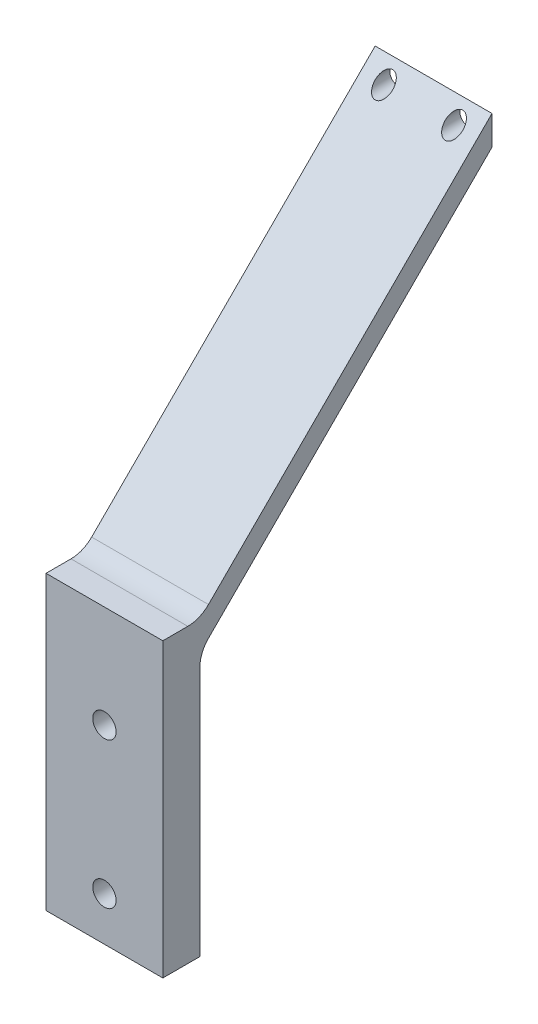
ISO-10303-21;
HEADER;
FILE_DESCRIPTION(('STEP AP214'),'2;1');
FILE_NAME('part.step','',(''),(''),'','','');
FILE_SCHEMA(('AUTOMOTIVE_DESIGN { 1 0 10303 214 1 1 1 1 }'));
ENDSEC;
DATA;
#1=APPLICATION_CONTEXT('core data for automotive mechanical design processes');
#2=APPLICATION_PROTOCOL_DEFINITION('international standard','automotive_design',2000,#1);
#3=PRODUCT_CONTEXT('',#1,'mechanical');
#4=PRODUCT('Part','Part','',(#3));
#5=PRODUCT_RELATED_PRODUCT_CATEGORY('part','',(#4));
#6=PRODUCT_DEFINITION_FORMATION('','',#4);
#7=PRODUCT_DEFINITION_CONTEXT('part definition',#1,'design');
#8=PRODUCT_DEFINITION('design','',#6,#7);
#9=PRODUCT_DEFINITION_SHAPE('','',#8);
#10=(LENGTH_UNIT() NAMED_UNIT(*) SI_UNIT(.MILLI.,.METRE.));
#11=(NAMED_UNIT(*) PLANE_ANGLE_UNIT() SI_UNIT($,.RADIAN.));
#12=(NAMED_UNIT(*) SI_UNIT($,.STERADIAN.) SOLID_ANGLE_UNIT());
#13=UNCERTAINTY_MEASURE_WITH_UNIT(LENGTH_MEASURE(1.E-05),#10,'distance_accuracy_value','');
#14=(GEOMETRIC_REPRESENTATION_CONTEXT(3) GLOBAL_UNCERTAINTY_ASSIGNED_CONTEXT((#13)) GLOBAL_UNIT_ASSIGNED_CONTEXT((#10,
#11,#12)) REPRESENTATION_CONTEXT('',''));
#15=CARTESIAN_POINT('',(0.,0.,0.));
#16=DIRECTION('',(0.,0.,1.));
#17=DIRECTION('',(1.,0.,0.));
#18=AXIS2_PLACEMENT_3D('',#15,#16,#17);
#19=CARTESIAN_POINT('',(0.,0.,0.));
#20=DIRECTION('',(0.,0.,-1.));
#21=DIRECTION('',(-1.,0.,0.));
#22=AXIS2_PLACEMENT_3D('',#19,#20,#21);
#23=PLANE('',#22);
#24=CARTESIAN_POINT('',(10.,32.5,0.));
#25=DIRECTION('',(0.,0.,1.));
#26=DIRECTION('',(1.,0.,0.));
#27=AXIS2_PLACEMENT_3D('',#24,#25,#26);
#28=CIRCLE('',#27,2.);
#29=CARTESIAN_POINT('',(12.,32.5,0.));
#30=VERTEX_POINT('',#29);
#31=EDGE_CURVE('E141',#30,#30,#28,.T.);
#32=ORIENTED_EDGE('',*,*,#31,.T.);
#33=EDGE_LOOP('',(#32));
#34=FACE_BOUND('',#33,.T.);
#35=CARTESIAN_POINT('',(10.,7.5,0.));
#36=DIRECTION('',(0.,0.,1.));
#37=DIRECTION('',(1.,0.,0.));
#38=AXIS2_PLACEMENT_3D('',#35,#36,#37);
#39=CIRCLE('',#38,2.);
#40=CARTESIAN_POINT('',(12.,7.5,0.));
#41=VERTEX_POINT('',#40);
#42=EDGE_CURVE('E137',#41,#41,#39,.T.);
#43=ORIENTED_EDGE('',*,*,#42,.T.);
#44=EDGE_LOOP('',(#43));
#45=FACE_BOUND('',#44,.T.);
#46=DIRECTION('',(0.,-1.,0.));
#47=VECTOR('',#46,1.);
#48=CARTESIAN_POINT('',(0.,0.,0.));
#49=LINE('',#48,#47);
#50=CARTESIAN_POINT('',(0.,42.9289321881345,0.));
#51=VERTEX_POINT('',#50);
#52=CARTESIAN_POINT('',(0.,0.,0.));
#53=VERTEX_POINT('',#52);
#54=EDGE_CURVE('E147',#51,#53,#49,.T.);
#55=ORIENTED_EDGE('',*,*,#54,.F.);
#56=DIRECTION('',(1.,0.,0.));
#57=VECTOR('',#56,1.);
#58=CARTESIAN_POINT('',(20.,42.9289321881345,0.));
#59=LINE('',#58,#57);
#60=CARTESIAN_POINT('',(20.,42.9289321881345,0.));
#61=VERTEX_POINT('',#60);
#62=EDGE_CURVE('E173',#51,#61,#59,.T.);
#63=ORIENTED_EDGE('',*,*,#62,.T.);
#64=DIRECTION('',(0.,1.,0.));
#65=VECTOR('',#64,1.);
#66=CARTESIAN_POINT('',(20.,0.,0.));
#67=LINE('',#66,#65);
#68=CARTESIAN_POINT('',(20.,0.,0.));
#69=VERTEX_POINT('',#68);
#70=EDGE_CURVE('E154',#69,#61,#67,.T.);
#71=ORIENTED_EDGE('',*,*,#70,.F.);
#72=DIRECTION('',(1.,0.,0.));
#73=VECTOR('',#72,1.);
#74=CARTESIAN_POINT('',(0.,0.,0.));
#75=LINE('',#74,#73);
#76=EDGE_CURVE('E160',#53,#69,#75,.T.);
#77=ORIENTED_EDGE('',*,*,#76,.F.);
#78=EDGE_LOOP('',(#55,#63,#71,#77));
#79=FACE_BOUND('',#78,.T.);
#80=ADVANCED_FACE('F33',(#34,#45,#79),#23,.T.);
#81=CARTESIAN_POINT('',(0.,0.,6.35));
#82=DIRECTION('',(0.,0.,-1.));
#83=DIRECTION('',(-1.,0.,0.));
#84=AXIS2_PLACEMENT_3D('',#81,#82,#83);
#85=PLANE('',#84);
#86=DIRECTION('',(0.,-1.,0.));
#87=VECTOR('',#86,1.);
#88=CARTESIAN_POINT('',(0.,0.,6.35));
#89=LINE('',#88,#87);
#90=CARTESIAN_POINT('',(0.,50.,6.35));
#91=VERTEX_POINT('',#90);
#92=CARTESIAN_POINT('',(0.,0.,6.35));
#93=VERTEX_POINT('',#92);
#94=EDGE_CURVE('E150',#91,#93,#89,.T.);
#95=ORIENTED_EDGE('',*,*,#94,.T.);
#96=DIRECTION('',(1.,0.,0.));
#97=VECTOR('',#96,1.);
#98=CARTESIAN_POINT('',(0.,0.,6.35));
#99=LINE('',#98,#97);
#100=CARTESIAN_POINT('',(20.,0.,6.35));
#101=VERTEX_POINT('',#100);
#102=EDGE_CURVE('E153',#93,#101,#99,.T.);
#103=ORIENTED_EDGE('',*,*,#102,.T.);
#104=DIRECTION('',(0.,1.,0.));
#105=VECTOR('',#104,1.);
#106=CARTESIAN_POINT('',(20.,0.,6.35));
#107=LINE('',#106,#105);
#108=CARTESIAN_POINT('',(20.,50.,6.35));
#109=VERTEX_POINT('',#108);
#110=EDGE_CURVE('E156',#101,#109,#107,.T.);
#111=ORIENTED_EDGE('',*,*,#110,.T.);
#112=DIRECTION('',(1.,0.,0.));
#113=VECTOR('',#112,1.);
#114=CARTESIAN_POINT('',(0.,50.,6.35));
#115=LINE('',#114,#113);
#116=EDGE_CURVE('E131',#91,#109,#115,.T.);
#117=ORIENTED_EDGE('',*,*,#116,.F.);
#118=EDGE_LOOP('',(#95,#103,#111,#117));
#119=FACE_BOUND('',#118,.T.);
#120=CARTESIAN_POINT('',(10.,32.5,6.35));
#121=DIRECTION('',(0.,0.,1.));
#122=DIRECTION('',(1.,0.,0.));
#123=AXIS2_PLACEMENT_3D('',#120,#121,#122);
#124=CIRCLE('',#123,2.);
#125=CARTESIAN_POINT('',(12.,32.5,6.35));
#126=VERTEX_POINT('',#125);
#127=EDGE_CURVE('E144',#126,#126,#124,.T.);
#128=ORIENTED_EDGE('',*,*,#127,.F.);
#129=EDGE_LOOP('',(#128));
#130=FACE_BOUND('',#129,.T.);
#131=CARTESIAN_POINT('',(10.,7.5,6.35));
#132=DIRECTION('',(0.,0.,1.));
#133=DIRECTION('',(1.,0.,0.));
#134=AXIS2_PLACEMENT_3D('',#131,#132,#133);
#135=CIRCLE('',#134,2.);
#136=CARTESIAN_POINT('',(12.,7.5,6.35));
#137=VERTEX_POINT('',#136);
#138=EDGE_CURVE('E138',#137,#137,#135,.T.);
#139=ORIENTED_EDGE('',*,*,#138,.F.);
#140=EDGE_LOOP('',(#139));
#141=FACE_BOUND('',#140,.T.);
#142=ADVANCED_FACE('F230',(#119,#130,#141),#85,.F.);
#143=CARTESIAN_POINT('',(0.,0.,6.35));
#144=DIRECTION('',(1.,0.,0.));
#145=DIRECTION('',(0.,0.,-1.));
#146=AXIS2_PLACEMENT_3D('',#143,#144,#145);
#147=PLANE('',#146);
#148=DIRECTION('',(0.,0.,1.));
#149=VECTOR('',#148,1.);
#150=CARTESIAN_POINT('',(0.,50.,0.));
#151=LINE('',#150,#149);
#152=CARTESIAN_POINT('',(0.,50.,2.07106781186548));
#153=VERTEX_POINT('',#152);
#154=EDGE_CURVE('E129',#153,#91,#151,.T.);
#155=ORIENTED_EDGE('',*,*,#154,.F.);
#156=CARTESIAN_POINT('',(0.,55.,2.07106781186548));
#157=DIRECTION('',(1.,0.,0.));
#158=DIRECTION('',(0.,0.,-1.));
#159=AXIS2_PLACEMENT_3D('',#156,#157,#158);
#160=CIRCLE('',#159,5.);
#161=CARTESIAN_POINT('',(0.,51.4644660940673,-1.46446609406726));
#162=VERTEX_POINT('',#161);
#163=EDGE_CURVE('E177',#153,#162,#160,.T.);
#164=ORIENTED_EDGE('',*,*,#163,.T.);
#165=DIRECTION('',(0.,0.707106781186548,-0.707106781186547));
#166=VECTOR('',#165,1.);
#167=CARTESIAN_POINT('',(0.,50.,0.));
#168=LINE('',#167,#166);
#169=CARTESIAN_POINT('',(0.,100.,-50.));
#170=VERTEX_POINT('',#169);
#171=EDGE_CURVE('E125',#162,#170,#168,.T.);
#172=ORIENTED_EDGE('',*,*,#171,.T.);
#173=DIRECTION('',(0.,-1.,0.));
#174=VECTOR('',#173,1.);
#175=CARTESIAN_POINT('',(0.,100.,-50.));
#176=LINE('',#175,#174);
#177=CARTESIAN_POINT('',(0.,95.,-50.));
#178=VERTEX_POINT('',#177);
#179=EDGE_CURVE('E127',#170,#178,#176,.T.);
#180=ORIENTED_EDGE('',*,*,#179,.T.);
#181=DIRECTION('',(0.,-0.707106781186548,0.707106781186548));
#182=VECTOR('',#181,1.);
#183=CARTESIAN_POINT('',(0.,95.,-50.));
#184=LINE('',#183,#182);
#185=CARTESIAN_POINT('',(0.,46.4644660940673,-1.46446609406725));
#186=VERTEX_POINT('',#185);
#187=EDGE_CURVE('E112',#178,#186,#184,.T.);
#188=ORIENTED_EDGE('',*,*,#187,.T.);
#189=CARTESIAN_POINT('',(0.,42.9289321881345,-5.));
#190=DIRECTION('',(1.,0.,0.));
#191=DIRECTION('',(0.,0.,-1.));
#192=AXIS2_PLACEMENT_3D('',#189,#190,#191);
#193=CIRCLE('',#192,5.);
#194=EDGE_CURVE('E11',#186,#51,#193,.T.);
#195=ORIENTED_EDGE('',*,*,#194,.T.);
#196=ORIENTED_EDGE('',*,*,#54,.T.);
#197=DIRECTION('',(0.,0.,-1.));
#198=VECTOR('',#197,1.);
#199=CARTESIAN_POINT('',(0.,0.,6.35));
#200=LINE('',#199,#198);
#201=EDGE_CURVE('E165',#93,#53,#200,.T.);
#202=ORIENTED_EDGE('',*,*,#201,.F.);
#203=ORIENTED_EDGE('',*,*,#94,.F.);
#204=EDGE_LOOP('',(#155,#164,#172,#180,#188,#195,#196,#202,#203));
#205=FACE_BOUND('',#204,.T.);
#206=ADVANCED_FACE('F193',(#205),#147,.F.);
#207=CARTESIAN_POINT('',(0.,0.,6.35));
#208=DIRECTION('',(0.,1.,0.));
#209=DIRECTION('',(0.,0.,1.));
#210=AXIS2_PLACEMENT_3D('',#207,#208,#209);
#211=PLANE('',#210);
#212=ORIENTED_EDGE('',*,*,#76,.T.);
#213=DIRECTION('',(0.,0.,-1.));
#214=VECTOR('',#213,1.);
#215=CARTESIAN_POINT('',(20.,0.,6.35));
#216=LINE('',#215,#214);
#217=EDGE_CURVE('E158',#101,#69,#216,.T.);
#218=ORIENTED_EDGE('',*,*,#217,.F.);
#219=ORIENTED_EDGE('',*,*,#102,.F.);
#220=ORIENTED_EDGE('',*,*,#201,.T.);
#221=EDGE_LOOP('',(#212,#218,#219,#220));
#222=FACE_BOUND('',#221,.T.);
#223=ADVANCED_FACE('F246',(#222),#211,.F.);
#224=CARTESIAN_POINT('',(20.,0.,6.35));
#225=DIRECTION('',(-1.,0.,0.));
#226=DIRECTION('',(0.,0.,1.));
#227=AXIS2_PLACEMENT_3D('',#224,#225,#226);
#228=PLANE('',#227);
#229=ORIENTED_EDGE('',*,*,#70,.T.);
#230=CARTESIAN_POINT('',(20.,42.9289321881345,-5.));
#231=DIRECTION('',(-1.,0.,0.));
#232=DIRECTION('',(0.,0.,1.));
#233=AXIS2_PLACEMENT_3D('',#230,#231,#232);
#234=CIRCLE('',#233,5.);
#235=CARTESIAN_POINT('',(20.,46.4644660940673,-1.46446609406727));
#236=VERTEX_POINT('',#235);
#237=EDGE_CURVE('E41',#61,#236,#234,.T.);
#238=ORIENTED_EDGE('',*,*,#237,.T.);
#239=DIRECTION('',(0.,0.707106781186547,-0.707106781186547));
#240=VECTOR('',#239,1.);
#241=CARTESIAN_POINT('',(20.,95.,-50.));
#242=LINE('',#241,#240);
#243=CARTESIAN_POINT('',(20.,95.,-50.));
#244=VERTEX_POINT('',#243);
#245=EDGE_CURVE('E101',#236,#244,#242,.T.);
#246=ORIENTED_EDGE('',*,*,#245,.T.);
#247=DIRECTION('',(0.,1.,0.));
#248=VECTOR('',#247,1.);
#249=CARTESIAN_POINT('',(20.,100.,-50.));
#250=LINE('',#249,#248);
#251=CARTESIAN_POINT('',(20.,100.,-50.));
#252=VERTEX_POINT('',#251);
#253=EDGE_CURVE('E106',#244,#252,#250,.T.);
#254=ORIENTED_EDGE('',*,*,#253,.T.);
#255=DIRECTION('',(0.,-0.707106781186548,0.707106781186547));
#256=VECTOR('',#255,1.);
#257=CARTESIAN_POINT('',(20.,50.,0.));
#258=LINE('',#257,#256);
#259=CARTESIAN_POINT('',(20.,51.4644660940673,-1.46446609406726));
#260=VERTEX_POINT('',#259);
#261=EDGE_CURVE('E116',#252,#260,#258,.T.);
#262=ORIENTED_EDGE('',*,*,#261,.T.);
#263=CARTESIAN_POINT('',(20.,55.,2.07106781186548));
#264=DIRECTION('',(-1.,0.,0.));
#265=DIRECTION('',(0.,0.,1.));
#266=AXIS2_PLACEMENT_3D('',#263,#264,#265);
#267=CIRCLE('',#266,5.);
#268=CARTESIAN_POINT('',(20.,50.,2.07106781186548));
#269=VERTEX_POINT('',#268);
#270=EDGE_CURVE('E179',#260,#269,#267,.T.);
#271=ORIENTED_EDGE('',*,*,#270,.T.);
#272=DIRECTION('',(0.,0.,-1.));
#273=VECTOR('',#272,1.);
#274=CARTESIAN_POINT('',(20.,50.,0.));
#275=LINE('',#274,#273);
#276=EDGE_CURVE('E134',#109,#269,#275,.T.);
#277=ORIENTED_EDGE('',*,*,#276,.F.);
#278=ORIENTED_EDGE('',*,*,#110,.F.);
#279=ORIENTED_EDGE('',*,*,#217,.T.);
#280=EDGE_LOOP('',(#229,#238,#246,#254,#262,#271,#277,#278,#279));
#281=FACE_BOUND('',#280,.T.);
#282=ADVANCED_FACE('F103',(#281),#228,.F.);
#283=CARTESIAN_POINT('',(10.,32.5,6.35));
#284=DIRECTION('',(0.,0.,-1.));
#285=DIRECTION('',(-1.,0.,0.));
#286=AXIS2_PLACEMENT_3D('',#283,#284,#285);
#287=CYLINDRICAL_SURFACE('',#286,2.);
#288=ORIENTED_EDGE('',*,*,#127,.T.);
#289=EDGE_LOOP('',(#288));
#290=FACE_BOUND('',#289,.T.);
#291=ORIENTED_EDGE('',*,*,#31,.F.);
#292=EDGE_LOOP('',(#291));
#293=FACE_BOUND('',#292,.T.);
#294=ADVANCED_FACE('F245',(#290,#293),#287,.F.);
#295=CARTESIAN_POINT('',(10.,7.5,6.35));
#296=DIRECTION('',(0.,0.,-1.));
#297=DIRECTION('',(-1.,0.,0.));
#298=AXIS2_PLACEMENT_3D('',#295,#296,#297);
#299=CYLINDRICAL_SURFACE('',#298,2.);
#300=ORIENTED_EDGE('',*,*,#138,.T.);
#301=EDGE_LOOP('',(#300));
#302=FACE_BOUND('',#301,.T.);
#303=ORIENTED_EDGE('',*,*,#42,.F.);
#304=EDGE_LOOP('',(#303));
#305=FACE_BOUND('',#304,.T.);
#306=ADVANCED_FACE('F270',(#302,#305),#299,.F.);
#307=CARTESIAN_POINT('',(0.,50.,0.));
#308=DIRECTION('',(0.,1.,0.));
#309=DIRECTION('',(0.,0.,1.));
#310=AXIS2_PLACEMENT_3D('',#307,#308,#309);
#311=PLANE('',#310);
#312=ORIENTED_EDGE('',*,*,#276,.T.);
#313=DIRECTION('',(-1.,0.,0.));
#314=VECTOR('',#313,1.);
#315=CARTESIAN_POINT('',(0.,50.,2.07106781186548));
#316=LINE('',#315,#314);
#317=EDGE_CURVE('E168',#269,#153,#316,.T.);
#318=ORIENTED_EDGE('',*,*,#317,.T.);
#319=ORIENTED_EDGE('',*,*,#154,.T.);
#320=ORIENTED_EDGE('',*,*,#116,.T.);
#321=EDGE_LOOP('',(#312,#318,#319,#320));
#322=FACE_BOUND('',#321,.T.);
#323=ADVANCED_FACE('F187',(#322),#311,.T.);
#324=CARTESIAN_POINT('',(-74.3303437365925,95.,-50.));
#325=DIRECTION('',(0.,-0.707106781186547,-0.707106781186547));
#326=DIRECTION('',(0.,0.707106781186548,-0.707106781186548));
#327=AXIS2_PLACEMENT_3D('',#324,#325,#326);
#328=PLANE('',#327);
#329=ORIENTED_EDGE('',*,*,#245,.F.);
#330=DIRECTION('',(1.,0.,0.));
#331=VECTOR('',#330,1.);
#332=CARTESIAN_POINT('',(0.,46.4644660940673,-1.46446609406726));
#333=LINE('',#332,#331);
#334=EDGE_CURVE('E54',#236,#186,#333,.F.);
#335=ORIENTED_EDGE('',*,*,#334,.T.);
#336=ORIENTED_EDGE('',*,*,#187,.F.);
#337=DIRECTION('',(1.,0.,0.));
#338=VECTOR('',#337,1.);
#339=CARTESIAN_POINT('',(-74.3303437365925,95.,-50.));
#340=LINE('',#339,#338);
#341=EDGE_CURVE('E110',#178,#244,#340,.T.);
#342=ORIENTED_EDGE('',*,*,#341,.T.);
#343=EDGE_LOOP('',(#329,#335,#336,#342));
#344=FACE_BOUND('',#343,.T.);
#345=ADVANCED_FACE('F111',(#344),#328,.T.);
#346=CARTESIAN_POINT('',(-74.3303437365925,50.,0.));
#347=DIRECTION('',(0.,0.707106781186547,0.707106781186548));
#348=DIRECTION('',(0.,-0.707106781186548,0.707106781186547));
#349=AXIS2_PLACEMENT_3D('',#346,#347,#348);
#350=PLANE('',#349);
#351=CARTESIAN_POINT('',(16.,97.5,-47.5));
#352=DIRECTION('',(0.,0.707106781186547,0.707106781186548));
#353=DIRECTION('',(0.,0.707106781186548,-0.707106781186547));
#354=AXIS2_PLACEMENT_3D('',#351,#352,#353);
#355=ELLIPSE('',#354,2.12132034355964,1.5);
#356=CARTESIAN_POINT('',(16.,99.,-49.));
#357=VERTEX_POINT('',#356);
#358=EDGE_CURVE('E107',#357,#357,#355,.T.);
#359=ORIENTED_EDGE('',*,*,#358,.F.);
#360=EDGE_LOOP('',(#359));
#361=FACE_BOUND('',#360,.T.);
#362=CARTESIAN_POINT('',(4.,97.5,-47.5));
#363=DIRECTION('',(0.,0.707106781186547,0.707106781186548));
#364=DIRECTION('',(0.,0.707106781186548,-0.707106781186547));
#365=AXIS2_PLACEMENT_3D('',#362,#363,#364);
#366=ELLIPSE('',#365,2.12132034355964,1.5);
#367=CARTESIAN_POINT('',(4.,99.,-49.));
#368=VERTEX_POINT('',#367);
#369=EDGE_CURVE('E201',#368,#368,#366,.T.);
#370=ORIENTED_EDGE('',*,*,#369,.F.);
#371=EDGE_LOOP('',(#370));
#372=FACE_BOUND('',#371,.T.);
#373=ORIENTED_EDGE('',*,*,#171,.F.);
#374=DIRECTION('',(-1.,0.,0.));
#375=VECTOR('',#374,1.);
#376=CARTESIAN_POINT('',(20.,51.4644660940673,-1.46446609406726));
#377=LINE('',#376,#375);
#378=EDGE_CURVE('E171',#162,#260,#377,.F.);
#379=ORIENTED_EDGE('',*,*,#378,.T.);
#380=ORIENTED_EDGE('',*,*,#261,.F.);
#381=DIRECTION('',(1.,0.,0.));
#382=VECTOR('',#381,1.);
#383=CARTESIAN_POINT('',(-74.3303437365925,100.,-50.));
#384=LINE('',#383,#382);
#385=EDGE_CURVE('E115',#170,#252,#384,.T.);
#386=ORIENTED_EDGE('',*,*,#385,.F.);
#387=EDGE_LOOP('',(#373,#379,#380,#386));
#388=FACE_BOUND('',#387,.T.);
#389=ADVANCED_FACE('F196',(#361,#372,#388),#350,.T.);
#390=CARTESIAN_POINT('',(-74.3303437365925,100.,-50.));
#391=DIRECTION('',(0.,0.,-1.));
#392=DIRECTION('',(-1.,0.,0.));
#393=AXIS2_PLACEMENT_3D('',#390,#391,#392);
#394=PLANE('',#393);
#395=CARTESIAN_POINT('',(16.,97.5,-50.));
#396=DIRECTION('',(0.,0.,-1.));
#397=DIRECTION('',(-1.,0.,0.));
#398=AXIS2_PLACEMENT_3D('',#395,#396,#397);
#399=CIRCLE('',#398,1.5);
#400=CARTESIAN_POINT('',(14.5,97.5,-50.));
#401=VERTEX_POINT('',#400);
#402=EDGE_CURVE('E204',#401,#401,#399,.T.);
#403=ORIENTED_EDGE('',*,*,#402,.F.);
#404=EDGE_LOOP('',(#403));
#405=FACE_BOUND('',#404,.T.);
#406=CARTESIAN_POINT('',(4.,97.5,-50.));
#407=DIRECTION('',(0.,0.,-1.));
#408=DIRECTION('',(-1.,0.,0.));
#409=AXIS2_PLACEMENT_3D('',#406,#407,#408);
#410=CIRCLE('',#409,1.5);
#411=CARTESIAN_POINT('',(2.5,97.5,-50.));
#412=VERTEX_POINT('',#411);
#413=EDGE_CURVE('E205',#412,#412,#410,.T.);
#414=ORIENTED_EDGE('',*,*,#413,.F.);
#415=EDGE_LOOP('',(#414));
#416=FACE_BOUND('',#415,.T.);
#417=ORIENTED_EDGE('',*,*,#179,.F.);
#418=ORIENTED_EDGE('',*,*,#385,.T.);
#419=ORIENTED_EDGE('',*,*,#253,.F.);
#420=ORIENTED_EDGE('',*,*,#341,.F.);
#421=EDGE_LOOP('',(#417,#418,#419,#420));
#422=FACE_BOUND('',#421,.T.);
#423=ADVANCED_FACE('F118',(#405,#416,#422),#394,.T.);
#424=CARTESIAN_POINT('',(4.,97.5,-26.8));
#425=DIRECTION('',(0.,0.,-1.));
#426=DIRECTION('',(-1.,0.,0.));
#427=AXIS2_PLACEMENT_3D('',#424,#425,#426);
#428=CYLINDRICAL_SURFACE('',#427,1.5);
#429=ORIENTED_EDGE('',*,*,#369,.T.);
#430=EDGE_LOOP('',(#429));
#431=FACE_BOUND('',#430,.T.);
#432=ORIENTED_EDGE('',*,*,#413,.T.);
#433=EDGE_LOOP('',(#432));
#434=FACE_BOUND('',#433,.T.);
#435=ADVANCED_FACE('F215',(#431,#434),#428,.F.);
#436=CARTESIAN_POINT('',(16.,97.5,-26.8));
#437=DIRECTION('',(0.,0.,-1.));
#438=DIRECTION('',(-1.,0.,0.));
#439=AXIS2_PLACEMENT_3D('',#436,#437,#438);
#440=CYLINDRICAL_SURFACE('',#439,1.5);
#441=ORIENTED_EDGE('',*,*,#358,.T.);
#442=EDGE_LOOP('',(#441));
#443=FACE_BOUND('',#442,.T.);
#444=ORIENTED_EDGE('',*,*,#402,.T.);
#445=EDGE_LOOP('',(#444));
#446=FACE_BOUND('',#445,.T.);
#447=ADVANCED_FACE('F211',(#443,#446),#440,.F.);
#448=CARTESIAN_POINT('',(0.,55.,2.07106781186548));
#449=DIRECTION('',(1.,0.,0.));
#450=DIRECTION('',(0.,0.,-1.));
#451=AXIS2_PLACEMENT_3D('',#448,#449,#450);
#452=CYLINDRICAL_SURFACE('',#451,5.);
#453=ORIENTED_EDGE('',*,*,#270,.F.);
#454=ORIENTED_EDGE('',*,*,#378,.F.);
#455=ORIENTED_EDGE('',*,*,#163,.F.);
#456=ORIENTED_EDGE('',*,*,#317,.F.);
#457=EDGE_LOOP('',(#453,#454,#455,#456));
#458=FACE_BOUND('',#457,.T.);
#459=ADVANCED_FACE('F190',(#458),#452,.F.);
#460=CARTESIAN_POINT('',(0.,42.9289321881345,-5.));
#461=DIRECTION('',(-1.,0.,0.));
#462=DIRECTION('',(0.,0.,1.));
#463=AXIS2_PLACEMENT_3D('',#460,#461,#462);
#464=CYLINDRICAL_SURFACE('',#463,5.);
#465=ORIENTED_EDGE('',*,*,#194,.F.);
#466=ORIENTED_EDGE('',*,*,#334,.F.);
#467=ORIENTED_EDGE('',*,*,#237,.F.);
#468=ORIENTED_EDGE('',*,*,#62,.F.);
#469=EDGE_LOOP('',(#465,#466,#467,#468));
#470=FACE_BOUND('',#469,.T.);
#471=ADVANCED_FACE('F35',(#470),#464,.F.);
#472=CLOSED_SHELL('',(#80,#142,#206,#223,#282,#294,#306,#323,#345,#389,#423,#435,#447,#459,#471));
#473=MANIFOLD_SOLID_BREP('B2',#472);
#474=ADVANCED_BREP_SHAPE_REPRESENTATION('',(#18,#473),#14);
#475=SHAPE_DEFINITION_REPRESENTATION(#9,#474);
ENDSEC;
END-ISO-10303-21;
